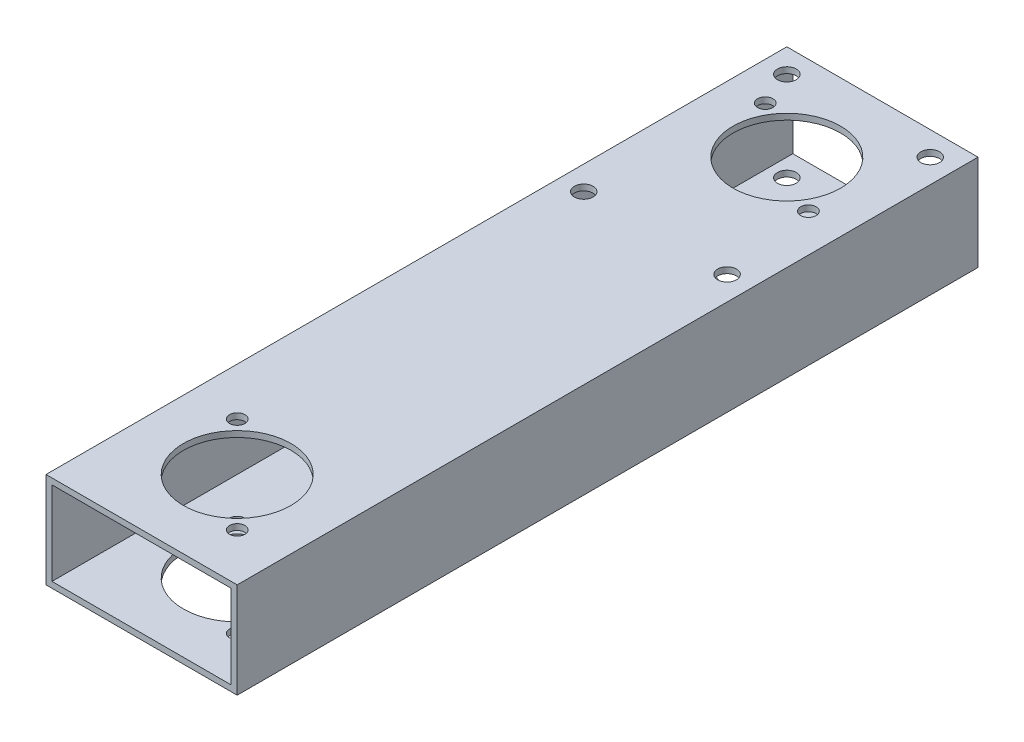
ISO-10303-21;
HEADER;
FILE_DESCRIPTION(('STEP AP214'),'2;1');
FILE_NAME('part.step','',(''),(''),'','','');
FILE_SCHEMA(('AUTOMOTIVE_DESIGN { 1 0 10303 214 1 1 1 1 }'));
ENDSEC;
DATA;
#1=APPLICATION_CONTEXT('core data for automotive mechanical design processes');
#2=APPLICATION_PROTOCOL_DEFINITION('international standard','automotive_design',2000,#1);
#3=PRODUCT_CONTEXT('',#1,'mechanical');
#4=PRODUCT('Part','Part','',(#3));
#5=PRODUCT_RELATED_PRODUCT_CATEGORY('part','',(#4));
#6=PRODUCT_DEFINITION_FORMATION('','',#4);
#7=PRODUCT_DEFINITION_CONTEXT('part definition',#1,'design');
#8=PRODUCT_DEFINITION('design','',#6,#7);
#9=PRODUCT_DEFINITION_SHAPE('','',#8);
#10=(LENGTH_UNIT() NAMED_UNIT(*) SI_UNIT(.MILLI.,.METRE.));
#11=(NAMED_UNIT(*) PLANE_ANGLE_UNIT() SI_UNIT($,.RADIAN.));
#12=(NAMED_UNIT(*) SI_UNIT($,.STERADIAN.) SOLID_ANGLE_UNIT());
#13=UNCERTAINTY_MEASURE_WITH_UNIT(LENGTH_MEASURE(1.E-05),#10,'distance_accuracy_value','');
#14=(GEOMETRIC_REPRESENTATION_CONTEXT(3) GLOBAL_UNCERTAINTY_ASSIGNED_CONTEXT((#13)) GLOBAL_UNIT_ASSIGNED_CONTEXT((#10,
#11,#12)) REPRESENTATION_CONTEXT('',''));
#15=CARTESIAN_POINT('',(0.,0.,0.));
#16=DIRECTION('',(0.,0.,1.));
#17=DIRECTION('',(1.,0.,0.));
#18=AXIS2_PLACEMENT_3D('',#15,#16,#17);
#19=CARTESIAN_POINT('',(25.4,12.7,98.4249994920001));
#20=DIRECTION('',(0.,-1.,0.));
#21=DIRECTION('',(1.,0.,0.));
#22=AXIS2_PLACEMENT_3D('',#19,#20,#21);
#23=PLANE('',#22);
#24=CARTESIAN_POINT('',(15.2936993631817,12.7,-63.4684359846216));
#25=DIRECTION('',(0.,1.,0.));
#26=DIRECTION('',(0.,0.,1.));
#27=AXIS2_PLACEMENT_3D('',#24,#25,#26);
#28=CIRCLE('',#27,2.04469999999999);
#29=CARTESIAN_POINT('',(15.2936993631817,12.7,-61.4237359846216));
#30=VERTEX_POINT('',#29);
#31=EDGE_CURVE('E485',#30,#30,#28,.T.);
#32=ORIENTED_EDGE('',*,*,#31,.F.);
#33=EDGE_LOOP('',(#32));
#34=FACE_BOUND('',#33,.T.);
#35=CARTESIAN_POINT('',(-12.751963692348,12.7,60.2730363083195));
#36=DIRECTION('',(0.,1.,0.));
#37=DIRECTION('',(0.,0.,1.));
#38=AXIS2_PLACEMENT_3D('',#35,#36,#37);
#39=CIRCLE('',#38,2.04469999999999);
#40=CARTESIAN_POINT('',(-12.751963692348,12.7,62.3177363083195));
#41=VERTEX_POINT('',#40);
#42=EDGE_CURVE('E254',#41,#41,#39,.T.);
#43=ORIENTED_EDGE('',*,*,#42,.F.);
#44=EDGE_LOOP('',(#43));
#45=FACE_BOUND('',#44,.T.);
#46=CARTESIAN_POINT('',(12.7519636914884,12.7,85.7769636921559));
#47=DIRECTION('',(0.,1.,0.));
#48=DIRECTION('',(0.,0.,1.));
#49=AXIS2_PLACEMENT_3D('',#46,#47,#48);
#50=CIRCLE('',#49,2.04469999999999);
#51=CARTESIAN_POINT('',(12.7519636914884,12.7,87.8216636921559));
#52=VERTEX_POINT('',#51);
#53=EDGE_CURVE('E251',#52,#52,#50,.T.);
#54=ORIENTED_EDGE('',*,*,#53,.F.);
#55=EDGE_LOOP('',(#54));
#56=FACE_BOUND('',#55,.T.);
#57=CARTESIAN_POINT('',(19.0500000000006,12.7,-38.0999994917968));
#58=DIRECTION('',(0.,1.,0.));
#59=DIRECTION('',(0.,0.,1.));
#60=AXIS2_PLACEMENT_3D('',#57,#58,#59);
#61=CIRCLE('',#60,2.48919999999999);
#62=CARTESIAN_POINT('',(19.0500000000006,12.7,-35.6107994917968));
#63=VERTEX_POINT('',#62);
#64=EDGE_CURVE('E274',#63,#63,#61,.T.);
#65=ORIENTED_EDGE('',*,*,#64,.F.);
#66=EDGE_LOOP('',(#65));
#67=FACE_BOUND('',#66,.T.);
#68=CARTESIAN_POINT('',(19.0500000000007,12.7,-92.0749994917965));
#69=DIRECTION('',(0.,1.,0.));
#70=DIRECTION('',(0.,0.,1.));
#71=AXIS2_PLACEMENT_3D('',#68,#69,#70);
#72=CIRCLE('',#71,2.48919999999999);
#73=CARTESIAN_POINT('',(19.0500000000007,12.7,-89.5857994917965));
#74=VERTEX_POINT('',#73);
#75=EDGE_CURVE('E284',#74,#74,#72,.T.);
#76=ORIENTED_EDGE('',*,*,#75,.F.);
#77=EDGE_LOOP('',(#76));
#78=FACE_BOUND('',#77,.T.);
#79=CARTESIAN_POINT('',(-19.0500000000001,12.7,-92.0749994917969));
#80=DIRECTION('',(0.,1.,0.));
#81=DIRECTION('',(0.,0.,1.));
#82=AXIS2_PLACEMENT_3D('',#79,#80,#81);
#83=CIRCLE('',#82,2.48919999999999);
#84=CARTESIAN_POINT('',(-19.0500000000001,12.7,-89.5857994917969));
#85=VERTEX_POINT('',#84);
#86=EDGE_CURVE('E294',#85,#85,#83,.T.);
#87=ORIENTED_EDGE('',*,*,#86,.F.);
#88=EDGE_LOOP('',(#87));
#89=FACE_BOUND('',#88,.T.);
#90=CARTESIAN_POINT('',(-19.0500000000001,12.7,-38.0999994917969));
#91=DIRECTION('',(0.,1.,0.));
#92=DIRECTION('',(0.,0.,1.));
#93=AXIS2_PLACEMENT_3D('',#90,#91,#92);
#94=CIRCLE('',#93,2.48919999999999);
#95=CARTESIAN_POINT('',(-19.0500000000001,12.7,-35.6107994917969));
#96=VERTEX_POINT('',#95);
#97=EDGE_CURVE('E304',#96,#96,#94,.T.);
#98=ORIENTED_EDGE('',*,*,#97,.F.);
#99=EDGE_LOOP('',(#98));
#100=FACE_BOUND('',#99,.T.);
#101=CARTESIAN_POINT('',(0.,12.7,-73.025));
#102=DIRECTION('',(0.,-1.,0.));
#103=DIRECTION('',(1.,0.,0.));
#104=AXIS2_PLACEMENT_3D('',#101,#102,#103);
#105=CIRCLE('',#104,14.2875);
#106=CARTESIAN_POINT('',(14.2875,12.7,-73.025));
#107=VERTEX_POINT('',#106);
#108=EDGE_CURVE('E207',#107,#107,#105,.T.);
#109=ORIENTED_EDGE('',*,*,#108,.T.);
#110=EDGE_LOOP('',(#109));
#111=FACE_BOUND('',#110,.T.);
#112=CARTESIAN_POINT('',(0.,12.7,73.025));
#113=DIRECTION('',(0.,-1.,0.));
#114=DIRECTION('',(1.,0.,0.));
#115=AXIS2_PLACEMENT_3D('',#112,#113,#114);
#116=CIRCLE('',#115,14.2875);
#117=CARTESIAN_POINT('',(14.2875,12.7,73.025));
#118=VERTEX_POINT('',#117);
#119=EDGE_CURVE('E314',#118,#118,#116,.T.);
#120=ORIENTED_EDGE('',*,*,#119,.T.);
#121=EDGE_LOOP('',(#120));
#122=FACE_BOUND('',#121,.T.);
#123=DIRECTION('',(0.,0.,-1.));
#124=VECTOR('',#123,1.);
#125=CARTESIAN_POINT('',(25.4,12.7,98.4249994920001));
#126=LINE('',#125,#124);
#127=CARTESIAN_POINT('',(25.4,12.7,98.4249994920001));
#128=VERTEX_POINT('',#127);
#129=CARTESIAN_POINT('',(25.4,12.7,-98.4249994920001));
#130=VERTEX_POINT('',#129);
#131=EDGE_CURVE('E197',#128,#130,#126,.T.);
#132=ORIENTED_EDGE('',*,*,#131,.T.);
#133=DIRECTION('',(-1.,0.,0.));
#134=VECTOR('',#133,1.);
#135=CARTESIAN_POINT('',(25.4,12.7,-98.4249994920001));
#136=LINE('',#135,#134);
#137=CARTESIAN_POINT('',(-25.4,12.7,-98.4249994920001));
#138=VERTEX_POINT('',#137);
#139=EDGE_CURVE('E162',#130,#138,#136,.T.);
#140=ORIENTED_EDGE('',*,*,#139,.T.);
#141=DIRECTION('',(0.,0.,-1.));
#142=VECTOR('',#141,1.);
#143=CARTESIAN_POINT('',(-25.4,12.7,98.4249994920001));
#144=LINE('',#143,#142);
#145=CARTESIAN_POINT('',(-25.4,12.7,98.4249994920001));
#146=VERTEX_POINT('',#145);
#147=EDGE_CURVE('E194',#146,#138,#144,.T.);
#148=ORIENTED_EDGE('',*,*,#147,.F.);
#149=DIRECTION('',(-1.,0.,0.));
#150=VECTOR('',#149,1.);
#151=CARTESIAN_POINT('',(25.4,12.7,98.4249994920001));
#152=LINE('',#151,#150);
#153=EDGE_CURVE('E66',#128,#146,#152,.T.);
#154=ORIENTED_EDGE('',*,*,#153,.F.);
#155=EDGE_LOOP('',(#132,#140,#148,#154));
#156=FACE_BOUND('',#155,.T.);
#157=CARTESIAN_POINT('',(-15.2936993640404,12.7,-82.5815640149031));
#158=DIRECTION('',(0.,1.,0.));
#159=DIRECTION('',(0.,0.,1.));
#160=AXIS2_PLACEMENT_3D('',#157,#158,#159);
#161=CIRCLE('',#160,2.04469999999999);
#162=CARTESIAN_POINT('',(-15.2936993640404,12.7,-80.5368640149031));
#163=VERTEX_POINT('',#162);
#164=EDGE_CURVE('E474',#163,#163,#161,.T.);
#165=ORIENTED_EDGE('',*,*,#164,.F.);
#166=EDGE_LOOP('',(#165));
#167=FACE_BOUND('',#166,.T.);
#168=ADVANCED_FACE('F40',(#34,#45,#56,#67,#78,#89,#100,#111,#122,#156,#167),#23,.F.);
#169=CARTESIAN_POINT('',(0.,0.,98.4249994920001));
#170=DIRECTION('',(0.,0.,1.));
#171=DIRECTION('',(1.,0.,0.));
#172=AXIS2_PLACEMENT_3D('',#169,#170,#171);
#173=PLANE('',#172);
#174=DIRECTION('',(0.,-1.,0.));
#175=VECTOR('',#174,1.);
#176=CARTESIAN_POINT('',(-25.4,12.7,98.4249994920001));
#177=LINE('',#176,#175);
#178=CARTESIAN_POINT('',(-25.4,-12.7,98.4249994920001));
#179=VERTEX_POINT('',#178);
#180=EDGE_CURVE('E120',#146,#179,#177,.T.);
#181=ORIENTED_EDGE('',*,*,#180,.T.);
#182=DIRECTION('',(1.,0.,0.));
#183=VECTOR('',#182,1.);
#184=CARTESIAN_POINT('',(-25.4,-12.7,98.4249994920001));
#185=LINE('',#184,#183);
#186=CARTESIAN_POINT('',(25.4,-12.7,98.4249994920001));
#187=VERTEX_POINT('',#186);
#188=EDGE_CURVE('E186',#179,#187,#185,.T.);
#189=ORIENTED_EDGE('',*,*,#188,.T.);
#190=DIRECTION('',(0.,1.,0.));
#191=VECTOR('',#190,1.);
#192=CARTESIAN_POINT('',(25.4,-12.7,98.4249994920001));
#193=LINE('',#192,#191);
#194=EDGE_CURVE('E189',#187,#128,#193,.T.);
#195=ORIENTED_EDGE('',*,*,#194,.T.);
#196=ORIENTED_EDGE('',*,*,#153,.T.);
#197=EDGE_LOOP('',(#181,#189,#195,#196));
#198=FACE_BOUND('',#197,.T.);
#199=DIRECTION('',(1.,0.,0.));
#200=VECTOR('',#199,1.);
#201=CARTESIAN_POINT('',(-23.8125,-11.1125,98.4249994920001));
#202=LINE('',#201,#200);
#203=CARTESIAN_POINT('',(-23.8125,-11.1125,98.4249994920001));
#204=VERTEX_POINT('',#203);
#205=CARTESIAN_POINT('',(23.8125,-11.1125,98.4249994920001));
#206=VERTEX_POINT('',#205);
#207=EDGE_CURVE('E168',#204,#206,#202,.T.);
#208=ORIENTED_EDGE('',*,*,#207,.F.);
#209=DIRECTION('',(0.,-1.,0.));
#210=VECTOR('',#209,1.);
#211=CARTESIAN_POINT('',(-23.8125,11.1125,98.4249994920001));
#212=LINE('',#211,#210);
#213=CARTESIAN_POINT('',(-23.8125,11.1125,98.4249994920001));
#214=VERTEX_POINT('',#213);
#215=EDGE_CURVE('E116',#214,#204,#212,.T.);
#216=ORIENTED_EDGE('',*,*,#215,.F.);
#217=DIRECTION('',(-1.,0.,0.));
#218=VECTOR('',#217,1.);
#219=CARTESIAN_POINT('',(23.8125,11.1125,98.4249994920001));
#220=LINE('',#219,#218);
#221=CARTESIAN_POINT('',(23.8125,11.1125,98.4249994920001));
#222=VERTEX_POINT('',#221);
#223=EDGE_CURVE('E174',#222,#214,#220,.T.);
#224=ORIENTED_EDGE('',*,*,#223,.F.);
#225=DIRECTION('',(0.,1.,0.));
#226=VECTOR('',#225,1.);
#227=CARTESIAN_POINT('',(23.8125,-11.1125,98.4249994920001));
#228=LINE('',#227,#226);
#229=EDGE_CURVE('E171',#206,#222,#228,.T.);
#230=ORIENTED_EDGE('',*,*,#229,.F.);
#231=EDGE_LOOP('',(#208,#216,#224,#230));
#232=FACE_BOUND('',#231,.T.);
#233=ADVANCED_FACE('F352',(#198,#232),#173,.T.);
#234=CARTESIAN_POINT('',(-25.4,12.7,98.4249994920001));
#235=DIRECTION('',(1.,0.,0.));
#236=DIRECTION('',(0.,0.,-1.));
#237=AXIS2_PLACEMENT_3D('',#234,#235,#236);
#238=PLANE('',#237);
#239=ORIENTED_EDGE('',*,*,#147,.T.);
#240=DIRECTION('',(0.,-1.,0.));
#241=VECTOR('',#240,1.);
#242=CARTESIAN_POINT('',(-25.4,12.7,-98.4249994920001));
#243=LINE('',#242,#241);
#244=CARTESIAN_POINT('',(-25.4,-12.7,-98.4249994920001));
#245=VERTEX_POINT('',#244);
#246=EDGE_CURVE('E150',#138,#245,#243,.T.);
#247=ORIENTED_EDGE('',*,*,#246,.T.);
#248=DIRECTION('',(0.,0.,-1.));
#249=VECTOR('',#248,1.);
#250=CARTESIAN_POINT('',(-25.4,-12.7,98.4249994920001));
#251=LINE('',#250,#249);
#252=EDGE_CURVE('E11',#179,#245,#251,.T.);
#253=ORIENTED_EDGE('',*,*,#252,.F.);
#254=ORIENTED_EDGE('',*,*,#180,.F.);
#255=EDGE_LOOP('',(#239,#247,#253,#254));
#256=FACE_BOUND('',#255,.T.);
#257=ADVANCED_FACE('F42',(#256),#238,.F.);
#258=CARTESIAN_POINT('',(-25.4,-12.7,98.4249994920001));
#259=DIRECTION('',(0.,1.,0.));
#260=DIRECTION('',(-1.,0.,0.));
#261=AXIS2_PLACEMENT_3D('',#258,#259,#260);
#262=PLANE('',#261);
#263=CARTESIAN_POINT('',(-15.2936993640404,-12.7,-82.5815640149031));
#264=DIRECTION('',(0.,1.,0.));
#265=DIRECTION('',(0.,0.,1.));
#266=AXIS2_PLACEMENT_3D('',#263,#264,#265);
#267=CIRCLE('',#266,2.0447);
#268=CARTESIAN_POINT('',(-15.2936993640404,-12.7,-80.5368640149031));
#269=VERTEX_POINT('',#268);
#270=EDGE_CURVE('E374',#269,#269,#267,.T.);
#271=ORIENTED_EDGE('',*,*,#270,.T.);
#272=EDGE_LOOP('',(#271));
#273=FACE_BOUND('',#272,.T.);
#274=CARTESIAN_POINT('',(15.2936993631817,-12.7,-63.4684359846216));
#275=DIRECTION('',(0.,1.,0.));
#276=DIRECTION('',(0.,0.,1.));
#277=AXIS2_PLACEMENT_3D('',#274,#275,#276);
#278=CIRCLE('',#277,2.0447);
#279=CARTESIAN_POINT('',(15.2936993631817,-12.7,-61.4237359846216));
#280=VERTEX_POINT('',#279);
#281=EDGE_CURVE('E377',#280,#280,#278,.T.);
#282=ORIENTED_EDGE('',*,*,#281,.T.);
#283=EDGE_LOOP('',(#282));
#284=FACE_BOUND('',#283,.T.);
#285=CARTESIAN_POINT('',(-12.751963692348,-12.7,60.2730363083195));
#286=DIRECTION('',(0.,1.,0.));
#287=DIRECTION('',(0.,0.,1.));
#288=AXIS2_PLACEMENT_3D('',#285,#286,#287);
#289=CIRCLE('',#288,2.0447);
#290=CARTESIAN_POINT('',(-12.751963692348,-12.7,62.3177363083195));
#291=VERTEX_POINT('',#290);
#292=EDGE_CURVE('E244',#291,#291,#289,.T.);
#293=ORIENTED_EDGE('',*,*,#292,.T.);
#294=EDGE_LOOP('',(#293));
#295=FACE_BOUND('',#294,.T.);
#296=CARTESIAN_POINT('',(12.7519636914884,-12.7,85.7769636921559));
#297=DIRECTION('',(0.,1.,0.));
#298=DIRECTION('',(0.,0.,1.));
#299=AXIS2_PLACEMENT_3D('',#296,#297,#298);
#300=CIRCLE('',#299,2.0447);
#301=CARTESIAN_POINT('',(12.7519636914884,-12.7,87.8216636921559));
#302=VERTEX_POINT('',#301);
#303=EDGE_CURVE('E239',#302,#302,#300,.T.);
#304=ORIENTED_EDGE('',*,*,#303,.T.);
#305=EDGE_LOOP('',(#304));
#306=FACE_BOUND('',#305,.T.);
#307=CARTESIAN_POINT('',(19.0500000000006,-12.7,-38.0999994917968));
#308=DIRECTION('',(0.,1.,0.));
#309=DIRECTION('',(0.,0.,1.));
#310=AXIS2_PLACEMENT_3D('',#307,#308,#309);
#311=CIRCLE('',#310,2.48919999999999);
#312=CARTESIAN_POINT('',(19.0500000000006,-12.7,-35.6107994917968));
#313=VERTEX_POINT('',#312);
#314=EDGE_CURVE('E234',#313,#313,#311,.T.);
#315=ORIENTED_EDGE('',*,*,#314,.T.);
#316=EDGE_LOOP('',(#315));
#317=FACE_BOUND('',#316,.T.);
#318=CARTESIAN_POINT('',(19.0500000000007,-12.7,-92.0749994917965));
#319=DIRECTION('',(0.,1.,0.));
#320=DIRECTION('',(0.,0.,1.));
#321=AXIS2_PLACEMENT_3D('',#318,#319,#320);
#322=CIRCLE('',#321,2.48919999999999);
#323=CARTESIAN_POINT('',(19.0500000000007,-12.7,-89.5857994917965));
#324=VERTEX_POINT('',#323);
#325=EDGE_CURVE('E228',#324,#324,#322,.T.);
#326=ORIENTED_EDGE('',*,*,#325,.T.);
#327=EDGE_LOOP('',(#326));
#328=FACE_BOUND('',#327,.T.);
#329=CARTESIAN_POINT('',(-19.0500000000001,-12.7,-92.0749994917969));
#330=DIRECTION('',(0.,1.,0.));
#331=DIRECTION('',(0.,0.,1.));
#332=AXIS2_PLACEMENT_3D('',#329,#330,#331);
#333=CIRCLE('',#332,2.48919999999999);
#334=CARTESIAN_POINT('',(-19.0500000000001,-12.7,-89.5857994917969));
#335=VERTEX_POINT('',#334);
#336=EDGE_CURVE('E222',#335,#335,#333,.T.);
#337=ORIENTED_EDGE('',*,*,#336,.T.);
#338=EDGE_LOOP('',(#337));
#339=FACE_BOUND('',#338,.T.);
#340=CARTESIAN_POINT('',(-19.0500000000001,-12.7,-38.0999994917969));
#341=DIRECTION('',(0.,1.,0.));
#342=DIRECTION('',(0.,0.,1.));
#343=AXIS2_PLACEMENT_3D('',#340,#341,#342);
#344=CIRCLE('',#343,2.48919999999999);
#345=CARTESIAN_POINT('',(-19.0500000000001,-12.7,-35.6107994917969));
#346=VERTEX_POINT('',#345);
#347=EDGE_CURVE('E216',#346,#346,#344,.T.);
#348=ORIENTED_EDGE('',*,*,#347,.T.);
#349=EDGE_LOOP('',(#348));
#350=FACE_BOUND('',#349,.T.);
#351=CARTESIAN_POINT('',(0.,-12.7,-73.025));
#352=DIRECTION('',(0.,-1.,0.));
#353=DIRECTION('',(1.,0.,0.));
#354=AXIS2_PLACEMENT_3D('',#351,#352,#353);
#355=CIRCLE('',#354,14.2875);
#356=CARTESIAN_POINT('',(14.2875,-12.7,-73.025));
#357=VERTEX_POINT('',#356);
#358=EDGE_CURVE('E318',#357,#357,#355,.T.);
#359=ORIENTED_EDGE('',*,*,#358,.F.);
#360=EDGE_LOOP('',(#359));
#361=FACE_BOUND('',#360,.T.);
#362=CARTESIAN_POINT('',(0.,-12.7,73.025));
#363=DIRECTION('',(0.,-1.,0.));
#364=DIRECTION('',(1.,0.,0.));
#365=AXIS2_PLACEMENT_3D('',#362,#363,#364);
#366=CIRCLE('',#365,14.2875);
#367=CARTESIAN_POINT('',(14.2875,-12.7,73.025));
#368=VERTEX_POINT('',#367);
#369=EDGE_CURVE('E322',#368,#368,#366,.T.);
#370=ORIENTED_EDGE('',*,*,#369,.F.);
#371=EDGE_LOOP('',(#370));
#372=FACE_BOUND('',#371,.T.);
#373=ORIENTED_EDGE('',*,*,#252,.T.);
#374=DIRECTION('',(1.,0.,0.));
#375=VECTOR('',#374,1.);
#376=CARTESIAN_POINT('',(-25.4,-12.7,-98.4249994920001));
#377=LINE('',#376,#375);
#378=CARTESIAN_POINT('',(25.4,-12.7,-98.4249994920001));
#379=VERTEX_POINT('',#378);
#380=EDGE_CURVE('E154',#245,#379,#377,.T.);
#381=ORIENTED_EDGE('',*,*,#380,.T.);
#382=DIRECTION('',(0.,0.,-1.));
#383=VECTOR('',#382,1.);
#384=CARTESIAN_POINT('',(25.4,-12.7,98.4249994920001));
#385=LINE('',#384,#383);
#386=EDGE_CURVE('E50',#187,#379,#385,.T.);
#387=ORIENTED_EDGE('',*,*,#386,.F.);
#388=ORIENTED_EDGE('',*,*,#188,.F.);
#389=EDGE_LOOP('',(#373,#381,#387,#388));
#390=FACE_BOUND('',#389,.T.);
#391=ADVANCED_FACE('F363',(#273,#284,#295,#306,#317,#328,#339,#350,#361,#372,#390),#262,.F.);
#392=CARTESIAN_POINT('',(25.4,-12.7,98.4249994920001));
#393=DIRECTION('',(-1.,0.,0.));
#394=DIRECTION('',(0.,0.,1.));
#395=AXIS2_PLACEMENT_3D('',#392,#393,#394);
#396=PLANE('',#395);
#397=ORIENTED_EDGE('',*,*,#386,.T.);
#398=DIRECTION('',(0.,1.,0.));
#399=VECTOR('',#398,1.);
#400=CARTESIAN_POINT('',(25.4,-12.7,-98.4249994920001));
#401=LINE('',#400,#399);
#402=EDGE_CURVE('E158',#379,#130,#401,.T.);
#403=ORIENTED_EDGE('',*,*,#402,.T.);
#404=ORIENTED_EDGE('',*,*,#131,.F.);
#405=ORIENTED_EDGE('',*,*,#194,.F.);
#406=EDGE_LOOP('',(#397,#403,#404,#405));
#407=FACE_BOUND('',#406,.T.);
#408=ADVANCED_FACE('F347',(#407),#396,.F.);
#409=CARTESIAN_POINT('',(-23.8125,11.1125,98.4249994920001));
#410=DIRECTION('',(1.,0.,0.));
#411=DIRECTION('',(0.,1.,0.));
#412=AXIS2_PLACEMENT_3D('',#409,#410,#411);
#413=PLANE('',#412);
#414=DIRECTION('',(0.,0.,-1.));
#415=VECTOR('',#414,1.);
#416=CARTESIAN_POINT('',(-23.8125,-11.1125,98.4249994920001));
#417=LINE('',#416,#415);
#418=CARTESIAN_POINT('',(-23.8125,-11.1125,-98.4249994920001));
#419=VERTEX_POINT('',#418);
#420=EDGE_CURVE('E108',#204,#419,#417,.T.);
#421=ORIENTED_EDGE('',*,*,#420,.T.);
#422=DIRECTION('',(0.,-1.,0.));
#423=VECTOR('',#422,1.);
#424=CARTESIAN_POINT('',(-23.8125,11.1125,-98.4249994920001));
#425=LINE('',#424,#423);
#426=CARTESIAN_POINT('',(-23.8125,11.1125,-98.4249994920001));
#427=VERTEX_POINT('',#426);
#428=EDGE_CURVE('E113',#427,#419,#425,.T.);
#429=ORIENTED_EDGE('',*,*,#428,.F.);
#430=DIRECTION('',(0.,0.,-1.));
#431=VECTOR('',#430,1.);
#432=CARTESIAN_POINT('',(-23.8125,11.1125,98.4249994920001));
#433=LINE('',#432,#431);
#434=EDGE_CURVE('E177',#214,#427,#433,.T.);
#435=ORIENTED_EDGE('',*,*,#434,.F.);
#436=ORIENTED_EDGE('',*,*,#215,.T.);
#437=EDGE_LOOP('',(#421,#429,#435,#436));
#438=FACE_BOUND('',#437,.T.);
#439=ADVANCED_FACE('F110',(#438),#413,.T.);
#440=CARTESIAN_POINT('',(-23.8125,-11.1125,98.4249994920001));
#441=DIRECTION('',(0.,1.,0.));
#442=DIRECTION('',(0.,0.,1.));
#443=AXIS2_PLACEMENT_3D('',#440,#441,#442);
#444=PLANE('',#443);
#445=CARTESIAN_POINT('',(-15.2936993640404,-11.1125,-82.5815640149031));
#446=DIRECTION('',(0.,1.,0.));
#447=DIRECTION('',(0.,0.,1.));
#448=AXIS2_PLACEMENT_3D('',#445,#446,#447);
#449=CIRCLE('',#448,2.04469999999999);
#450=CARTESIAN_POINT('',(-15.2936993640404,-11.1125,-80.5368640149031));
#451=VERTEX_POINT('',#450);
#452=EDGE_CURVE('E481',#451,#451,#449,.T.);
#453=ORIENTED_EDGE('',*,*,#452,.F.);
#454=EDGE_LOOP('',(#453));
#455=FACE_BOUND('',#454,.T.);
#456=CARTESIAN_POINT('',(15.2936993631817,-11.1125,-63.4684359846216));
#457=DIRECTION('',(0.,1.,0.));
#458=DIRECTION('',(0.,0.,1.));
#459=AXIS2_PLACEMENT_3D('',#456,#457,#458);
#460=CIRCLE('',#459,2.04469999999999);
#461=CARTESIAN_POINT('',(15.2936993631817,-11.1125,-61.4237359846216));
#462=VERTEX_POINT('',#461);
#463=EDGE_CURVE('E261',#462,#462,#460,.T.);
#464=ORIENTED_EDGE('',*,*,#463,.F.);
#465=EDGE_LOOP('',(#464));
#466=FACE_BOUND('',#465,.T.);
#467=CARTESIAN_POINT('',(-12.751963692348,-11.1125,60.2730363083195));
#468=DIRECTION('',(0.,1.,0.));
#469=DIRECTION('',(0.,0.,1.));
#470=AXIS2_PLACEMENT_3D('',#467,#468,#469);
#471=CIRCLE('',#470,2.04469999999999);
#472=CARTESIAN_POINT('',(-12.751963692348,-11.1125,62.3177363083195));
#473=VERTEX_POINT('',#472);
#474=EDGE_CURVE('E240',#473,#473,#471,.T.);
#475=ORIENTED_EDGE('',*,*,#474,.F.);
#476=EDGE_LOOP('',(#475));
#477=FACE_BOUND('',#476,.T.);
#478=CARTESIAN_POINT('',(12.7519636914884,-11.1125,85.7769636921559));
#479=DIRECTION('',(0.,1.,0.));
#480=DIRECTION('',(0.,0.,1.));
#481=AXIS2_PLACEMENT_3D('',#478,#479,#480);
#482=CIRCLE('',#481,2.04469999999999);
#483=CARTESIAN_POINT('',(12.7519636914884,-11.1125,87.8216636921559));
#484=VERTEX_POINT('',#483);
#485=EDGE_CURVE('E235',#484,#484,#482,.T.);
#486=ORIENTED_EDGE('',*,*,#485,.F.);
#487=EDGE_LOOP('',(#486));
#488=FACE_BOUND('',#487,.T.);
#489=CARTESIAN_POINT('',(19.0500000000006,-11.1125,-38.0999994917968));
#490=DIRECTION('',(0.,1.,0.));
#491=DIRECTION('',(0.,0.,1.));
#492=AXIS2_PLACEMENT_3D('',#489,#490,#491);
#493=CIRCLE('',#492,2.48919999999999);
#494=CARTESIAN_POINT('',(19.0500000000006,-11.1125,-35.6107994917968));
#495=VERTEX_POINT('',#494);
#496=EDGE_CURVE('E229',#495,#495,#493,.T.);
#497=ORIENTED_EDGE('',*,*,#496,.F.);
#498=EDGE_LOOP('',(#497));
#499=FACE_BOUND('',#498,.T.);
#500=CARTESIAN_POINT('',(19.0500000000007,-11.1125,-92.0749994917965));
#501=DIRECTION('',(0.,1.,0.));
#502=DIRECTION('',(0.,0.,1.));
#503=AXIS2_PLACEMENT_3D('',#500,#501,#502);
#504=CIRCLE('',#503,2.48919999999999);
#505=CARTESIAN_POINT('',(19.0500000000007,-11.1125,-89.5857994917965));
#506=VERTEX_POINT('',#505);
#507=EDGE_CURVE('E223',#506,#506,#504,.T.);
#508=ORIENTED_EDGE('',*,*,#507,.F.);
#509=EDGE_LOOP('',(#508));
#510=FACE_BOUND('',#509,.T.);
#511=CARTESIAN_POINT('',(-19.0500000000001,-11.1125,-92.0749994917969));
#512=DIRECTION('',(0.,1.,0.));
#513=DIRECTION('',(0.,0.,1.));
#514=AXIS2_PLACEMENT_3D('',#511,#512,#513);
#515=CIRCLE('',#514,2.48919999999999);
#516=CARTESIAN_POINT('',(-19.0500000000001,-11.1125,-89.5857994917969));
#517=VERTEX_POINT('',#516);
#518=EDGE_CURVE('E217',#517,#517,#515,.T.);
#519=ORIENTED_EDGE('',*,*,#518,.F.);
#520=EDGE_LOOP('',(#519));
#521=FACE_BOUND('',#520,.T.);
#522=CARTESIAN_POINT('',(-19.0500000000001,-11.1125,-38.0999994917969));
#523=DIRECTION('',(0.,1.,0.));
#524=DIRECTION('',(0.,0.,1.));
#525=AXIS2_PLACEMENT_3D('',#522,#523,#524);
#526=CIRCLE('',#525,2.48919999999999);
#527=CARTESIAN_POINT('',(-19.0500000000001,-11.1125,-35.6107994917969));
#528=VERTEX_POINT('',#527);
#529=EDGE_CURVE('E211',#528,#528,#526,.T.);
#530=ORIENTED_EDGE('',*,*,#529,.F.);
#531=EDGE_LOOP('',(#530));
#532=FACE_BOUND('',#531,.T.);
#533=CARTESIAN_POINT('',(0.,-11.1125,-73.025));
#534=DIRECTION('',(0.,1.,0.));
#535=DIRECTION('',(0.,0.,1.));
#536=AXIS2_PLACEMENT_3D('',#533,#534,#535);
#537=CIRCLE('',#536,14.2875);
#538=CARTESIAN_POINT('',(0.,-11.1125,-58.7375));
#539=VERTEX_POINT('',#538);
#540=EDGE_CURVE('E137',#539,#539,#537,.T.);
#541=ORIENTED_EDGE('',*,*,#540,.F.);
#542=EDGE_LOOP('',(#541));
#543=FACE_BOUND('',#542,.T.);
#544=CARTESIAN_POINT('',(0.,-11.1125,73.025));
#545=DIRECTION('',(0.,1.,0.));
#546=DIRECTION('',(0.,0.,1.));
#547=AXIS2_PLACEMENT_3D('',#544,#545,#546);
#548=CIRCLE('',#547,14.2875);
#549=CARTESIAN_POINT('',(0.,-11.1125,87.3125));
#550=VERTEX_POINT('',#549);
#551=EDGE_CURVE('E206',#550,#550,#548,.T.);
#552=ORIENTED_EDGE('',*,*,#551,.F.);
#553=EDGE_LOOP('',(#552));
#554=FACE_BOUND('',#553,.T.);
#555=DIRECTION('',(0.,0.,-1.));
#556=VECTOR('',#555,1.);
#557=CARTESIAN_POINT('',(23.8125,-11.1125,98.4249994920001));
#558=LINE('',#557,#556);
#559=CARTESIAN_POINT('',(23.8125,-11.1125,-98.4249994920001));
#560=VERTEX_POINT('',#559);
#561=EDGE_CURVE('E121',#206,#560,#558,.T.);
#562=ORIENTED_EDGE('',*,*,#561,.T.);
#563=DIRECTION('',(1.,0.,0.));
#564=VECTOR('',#563,1.);
#565=CARTESIAN_POINT('',(-23.8125,-11.1125,-98.4249994920001));
#566=LINE('',#565,#564);
#567=EDGE_CURVE('E124',#419,#560,#566,.T.);
#568=ORIENTED_EDGE('',*,*,#567,.F.);
#569=ORIENTED_EDGE('',*,*,#420,.F.);
#570=ORIENTED_EDGE('',*,*,#207,.T.);
#571=EDGE_LOOP('',(#562,#568,#569,#570));
#572=FACE_BOUND('',#571,.T.);
#573=ADVANCED_FACE('F125',(#455,#466,#477,#488,#499,#510,#521,#532,#543,#554,#572),#444,.T.);
#574=CARTESIAN_POINT('',(23.8125,-11.1125,98.4249994920001));
#575=DIRECTION('',(-1.,0.,0.));
#576=DIRECTION('',(0.,0.,1.));
#577=AXIS2_PLACEMENT_3D('',#574,#575,#576);
#578=PLANE('',#577);
#579=DIRECTION('',(0.,0.,-1.));
#580=VECTOR('',#579,1.);
#581=CARTESIAN_POINT('',(23.8125,11.1125,98.4249994920001));
#582=LINE('',#581,#580);
#583=CARTESIAN_POINT('',(23.8125,11.1125,-98.4249994920001));
#584=VERTEX_POINT('',#583);
#585=EDGE_CURVE('E58',#222,#584,#582,.T.);
#586=ORIENTED_EDGE('',*,*,#585,.T.);
#587=DIRECTION('',(0.,1.,0.));
#588=VECTOR('',#587,1.);
#589=CARTESIAN_POINT('',(23.8125,-11.1125,-98.4249994920001));
#590=LINE('',#589,#588);
#591=EDGE_CURVE('E131',#560,#584,#590,.T.);
#592=ORIENTED_EDGE('',*,*,#591,.F.);
#593=ORIENTED_EDGE('',*,*,#561,.F.);
#594=ORIENTED_EDGE('',*,*,#229,.T.);
#595=EDGE_LOOP('',(#586,#592,#593,#594));
#596=FACE_BOUND('',#595,.T.);
#597=ADVANCED_FACE('F337',(#596),#578,.T.);
#598=CARTESIAN_POINT('',(23.8125,11.1125,98.4249994920001));
#599=DIRECTION('',(0.,-1.,0.));
#600=DIRECTION('',(0.,0.,-1.));
#601=AXIS2_PLACEMENT_3D('',#598,#599,#600);
#602=PLANE('',#601);
#603=CARTESIAN_POINT('',(-15.2936993640404,11.1125,-82.5815640149031));
#604=DIRECTION('',(0.,-1.,0.));
#605=DIRECTION('',(0.,0.,-1.));
#606=AXIS2_PLACEMENT_3D('',#603,#604,#605);
#607=CIRCLE('',#606,2.04469999999999);
#608=CARTESIAN_POINT('',(-15.2936993640404,11.1125,-84.6262640149031));
#609=VERTEX_POINT('',#608);
#610=EDGE_CURVE('E44',#609,#609,#607,.T.);
#611=ORIENTED_EDGE('',*,*,#610,.F.);
#612=EDGE_LOOP('',(#611));
#613=FACE_BOUND('',#612,.T.);
#614=CARTESIAN_POINT('',(15.2936993631817,11.1125,-63.4684359846216));
#615=DIRECTION('',(0.,-1.,0.));
#616=DIRECTION('',(0.,0.,-1.));
#617=AXIS2_PLACEMENT_3D('',#614,#615,#616);
#618=CIRCLE('',#617,2.04469999999999);
#619=CARTESIAN_POINT('',(15.2936993631817,11.1125,-65.5131359846216));
#620=VERTEX_POINT('',#619);
#621=EDGE_CURVE('E491',#620,#620,#618,.T.);
#622=ORIENTED_EDGE('',*,*,#621,.F.);
#623=EDGE_LOOP('',(#622));
#624=FACE_BOUND('',#623,.T.);
#625=CARTESIAN_POINT('',(-12.751963692348,11.1125,60.2730363083195));
#626=DIRECTION('',(0.,-1.,0.));
#627=DIRECTION('',(0.,0.,-1.));
#628=AXIS2_PLACEMENT_3D('',#625,#626,#627);
#629=CIRCLE('',#628,2.04469999999999);
#630=CARTESIAN_POINT('',(-12.751963692348,11.1125,58.2283363083195));
#631=VERTEX_POINT('',#630);
#632=EDGE_CURVE('E243',#631,#631,#629,.T.);
#633=ORIENTED_EDGE('',*,*,#632,.F.);
#634=EDGE_LOOP('',(#633));
#635=FACE_BOUND('',#634,.T.);
#636=CARTESIAN_POINT('',(12.7519636914884,11.1125,85.7769636921559));
#637=DIRECTION('',(0.,-1.,0.));
#638=DIRECTION('',(0.,0.,-1.));
#639=AXIS2_PLACEMENT_3D('',#636,#637,#638);
#640=CIRCLE('',#639,2.04469999999999);
#641=CARTESIAN_POINT('',(12.7519636914884,11.1125,83.7322636921559));
#642=VERTEX_POINT('',#641);
#643=EDGE_CURVE('E238',#642,#642,#640,.T.);
#644=ORIENTED_EDGE('',*,*,#643,.F.);
#645=EDGE_LOOP('',(#644));
#646=FACE_BOUND('',#645,.T.);
#647=CARTESIAN_POINT('',(19.0500000000006,11.1125,-38.0999994917968));
#648=DIRECTION('',(0.,-1.,0.));
#649=DIRECTION('',(0.,0.,-1.));
#650=AXIS2_PLACEMENT_3D('',#647,#648,#649);
#651=CIRCLE('',#650,2.48919999999999);
#652=CARTESIAN_POINT('',(19.0500000000006,11.1125,-40.5891994917968));
#653=VERTEX_POINT('',#652);
#654=EDGE_CURVE('E233',#653,#653,#651,.T.);
#655=ORIENTED_EDGE('',*,*,#654,.F.);
#656=EDGE_LOOP('',(#655));
#657=FACE_BOUND('',#656,.T.);
#658=CARTESIAN_POINT('',(19.0500000000007,11.1125,-92.0749994917965));
#659=DIRECTION('',(0.,-1.,0.));
#660=DIRECTION('',(0.,0.,-1.));
#661=AXIS2_PLACEMENT_3D('',#658,#659,#660);
#662=CIRCLE('',#661,2.48919999999999);
#663=CARTESIAN_POINT('',(19.0500000000007,11.1125,-94.5641994917965));
#664=VERTEX_POINT('',#663);
#665=EDGE_CURVE('E227',#664,#664,#662,.T.);
#666=ORIENTED_EDGE('',*,*,#665,.F.);
#667=EDGE_LOOP('',(#666));
#668=FACE_BOUND('',#667,.T.);
#669=CARTESIAN_POINT('',(-19.0500000000001,11.1125,-92.0749994917969));
#670=DIRECTION('',(0.,-1.,0.));
#671=DIRECTION('',(0.,0.,-1.));
#672=AXIS2_PLACEMENT_3D('',#669,#670,#671);
#673=CIRCLE('',#672,2.48919999999999);
#674=CARTESIAN_POINT('',(-19.0500000000001,11.1125,-94.5641994917969));
#675=VERTEX_POINT('',#674);
#676=EDGE_CURVE('E221',#675,#675,#673,.T.);
#677=ORIENTED_EDGE('',*,*,#676,.F.);
#678=EDGE_LOOP('',(#677));
#679=FACE_BOUND('',#678,.T.);
#680=CARTESIAN_POINT('',(-19.0500000000001,11.1125,-38.0999994917969));
#681=DIRECTION('',(0.,-1.,0.));
#682=DIRECTION('',(0.,0.,-1.));
#683=AXIS2_PLACEMENT_3D('',#680,#681,#682);
#684=CIRCLE('',#683,2.48919999999999);
#685=CARTESIAN_POINT('',(-19.0500000000001,11.1125,-40.5891994917969));
#686=VERTEX_POINT('',#685);
#687=EDGE_CURVE('E215',#686,#686,#684,.T.);
#688=ORIENTED_EDGE('',*,*,#687,.F.);
#689=EDGE_LOOP('',(#688));
#690=FACE_BOUND('',#689,.T.);
#691=CARTESIAN_POINT('',(0.,11.1125,-73.025));
#692=DIRECTION('',(0.,-1.,0.));
#693=DIRECTION('',(0.,0.,-1.));
#694=AXIS2_PLACEMENT_3D('',#691,#692,#693);
#695=CIRCLE('',#694,14.2875);
#696=CARTESIAN_POINT('',(0.,11.1125,-87.3125));
#697=VERTEX_POINT('',#696);
#698=EDGE_CURVE('E142',#697,#697,#695,.T.);
#699=ORIENTED_EDGE('',*,*,#698,.F.);
#700=EDGE_LOOP('',(#699));
#701=FACE_BOUND('',#700,.T.);
#702=CARTESIAN_POINT('',(0.,11.1125,73.025));
#703=DIRECTION('',(0.,-1.,0.));
#704=DIRECTION('',(0.,0.,-1.));
#705=AXIS2_PLACEMENT_3D('',#702,#703,#704);
#706=CIRCLE('',#705,14.2875);
#707=CARTESIAN_POINT('',(0.,11.1125,58.7375));
#708=VERTEX_POINT('',#707);
#709=EDGE_CURVE('E202',#708,#708,#706,.T.);
#710=ORIENTED_EDGE('',*,*,#709,.F.);
#711=EDGE_LOOP('',(#710));
#712=FACE_BOUND('',#711,.T.);
#713=ORIENTED_EDGE('',*,*,#434,.T.);
#714=DIRECTION('',(-1.,0.,0.));
#715=VECTOR('',#714,1.);
#716=CARTESIAN_POINT('',(23.8125,11.1125,-98.4249994920001));
#717=LINE('',#716,#715);
#718=EDGE_CURVE('E135',#584,#427,#717,.T.);
#719=ORIENTED_EDGE('',*,*,#718,.F.);
#720=ORIENTED_EDGE('',*,*,#585,.F.);
#721=ORIENTED_EDGE('',*,*,#223,.T.);
#722=EDGE_LOOP('',(#713,#719,#720,#721));
#723=FACE_BOUND('',#722,.T.);
#724=ADVANCED_FACE('F344',(#613,#624,#635,#646,#657,#668,#679,#690,#701,#712,#723),#602,.T.);
#725=CARTESIAN_POINT('',(0.,0.,-98.4249994920001));
#726=DIRECTION('',(0.,0.,1.));
#727=DIRECTION('',(1.,0.,0.));
#728=AXIS2_PLACEMENT_3D('',#725,#726,#727);
#729=PLANE('',#728);
#730=ORIENTED_EDGE('',*,*,#718,.T.);
#731=ORIENTED_EDGE('',*,*,#428,.T.);
#732=ORIENTED_EDGE('',*,*,#567,.T.);
#733=ORIENTED_EDGE('',*,*,#591,.T.);
#734=EDGE_LOOP('',(#730,#731,#732,#733));
#735=FACE_BOUND('',#734,.T.);
#736=ORIENTED_EDGE('',*,*,#246,.F.);
#737=ORIENTED_EDGE('',*,*,#139,.F.);
#738=ORIENTED_EDGE('',*,*,#402,.F.);
#739=ORIENTED_EDGE('',*,*,#380,.F.);
#740=EDGE_LOOP('',(#736,#737,#738,#739));
#741=FACE_BOUND('',#740,.T.);
#742=ADVANCED_FACE('F133',(#735,#741),#729,.F.);
#743=CARTESIAN_POINT('',(0.,12.7,73.025));
#744=DIRECTION('',(0.,-1.,0.));
#745=DIRECTION('',(1.,0.,0.));
#746=AXIS2_PLACEMENT_3D('',#743,#744,#745);
#747=CYLINDRICAL_SURFACE('',#746,14.2875);
#748=ORIENTED_EDGE('',*,*,#709,.T.);
#749=EDGE_LOOP('',(#748));
#750=FACE_BOUND('',#749,.T.);
#751=ORIENTED_EDGE('',*,*,#119,.F.);
#752=EDGE_LOOP('',(#751));
#753=FACE_BOUND('',#752,.T.);
#754=ADVANCED_FACE('F413',(#750,#753),#747,.F.);
#755=CARTESIAN_POINT('',(0.,12.7,-73.025));
#756=DIRECTION('',(0.,-1.,0.));
#757=DIRECTION('',(1.,0.,0.));
#758=AXIS2_PLACEMENT_3D('',#755,#756,#757);
#759=CYLINDRICAL_SURFACE('',#758,14.2875);
#760=ORIENTED_EDGE('',*,*,#698,.T.);
#761=EDGE_LOOP('',(#760));
#762=FACE_BOUND('',#761,.T.);
#763=ORIENTED_EDGE('',*,*,#108,.F.);
#764=EDGE_LOOP('',(#763));
#765=FACE_BOUND('',#764,.T.);
#766=ADVANCED_FACE('F420',(#762,#765),#759,.F.);
#767=ORIENTED_EDGE('',*,*,#551,.T.);
#768=EDGE_LOOP('',(#767));
#769=FACE_BOUND('',#768,.T.);
#770=ORIENTED_EDGE('',*,*,#369,.T.);
#771=EDGE_LOOP('',(#770));
#772=FACE_BOUND('',#771,.T.);
#773=ADVANCED_FACE('F333',(#769,#772),#747,.F.);
#774=ORIENTED_EDGE('',*,*,#540,.T.);
#775=EDGE_LOOP('',(#774));
#776=FACE_BOUND('',#775,.T.);
#777=ORIENTED_EDGE('',*,*,#358,.T.);
#778=EDGE_LOOP('',(#777));
#779=FACE_BOUND('',#778,.T.);
#780=ADVANCED_FACE('F425',(#776,#779),#759,.F.);
#781=CARTESIAN_POINT('',(-19.0500000000001,12.7,-38.0999994917969));
#782=DIRECTION('',(0.,1.,0.));
#783=DIRECTION('',(0.,0.,1.));
#784=AXIS2_PLACEMENT_3D('',#781,#782,#783);
#785=CYLINDRICAL_SURFACE('',#784,2.48919999999999);
#786=ORIENTED_EDGE('',*,*,#529,.T.);
#787=EDGE_LOOP('',(#786));
#788=FACE_BOUND('',#787,.T.);
#789=ORIENTED_EDGE('',*,*,#347,.F.);
#790=EDGE_LOOP('',(#789));
#791=FACE_BOUND('',#790,.T.);
#792=ADVANCED_FACE('F426',(#788,#791),#785,.F.);
#793=ORIENTED_EDGE('',*,*,#687,.T.);
#794=EDGE_LOOP('',(#793));
#795=FACE_BOUND('',#794,.T.);
#796=ORIENTED_EDGE('',*,*,#97,.T.);
#797=EDGE_LOOP('',(#796));
#798=FACE_BOUND('',#797,.T.);
#799=ADVANCED_FACE('F429',(#795,#798),#785,.F.);
#800=CARTESIAN_POINT('',(-19.0500000000001,12.7,-92.0749994917969));
#801=DIRECTION('',(0.,1.,0.));
#802=DIRECTION('',(0.,0.,1.));
#803=AXIS2_PLACEMENT_3D('',#800,#801,#802);
#804=CYLINDRICAL_SURFACE('',#803,2.48919999999999);
#805=ORIENTED_EDGE('',*,*,#518,.T.);
#806=EDGE_LOOP('',(#805));
#807=FACE_BOUND('',#806,.T.);
#808=ORIENTED_EDGE('',*,*,#336,.F.);
#809=EDGE_LOOP('',(#808));
#810=FACE_BOUND('',#809,.T.);
#811=ADVANCED_FACE('F431',(#807,#810),#804,.F.);
#812=ORIENTED_EDGE('',*,*,#676,.T.);
#813=EDGE_LOOP('',(#812));
#814=FACE_BOUND('',#813,.T.);
#815=ORIENTED_EDGE('',*,*,#86,.T.);
#816=EDGE_LOOP('',(#815));
#817=FACE_BOUND('',#816,.T.);
#818=ADVANCED_FACE('F434',(#814,#817),#804,.F.);
#819=CARTESIAN_POINT('',(19.0500000000007,12.7,-92.0749994917965));
#820=DIRECTION('',(0.,1.,0.));
#821=DIRECTION('',(0.,0.,1.));
#822=AXIS2_PLACEMENT_3D('',#819,#820,#821);
#823=CYLINDRICAL_SURFACE('',#822,2.48919999999999);
#824=ORIENTED_EDGE('',*,*,#507,.T.);
#825=EDGE_LOOP('',(#824));
#826=FACE_BOUND('',#825,.T.);
#827=ORIENTED_EDGE('',*,*,#325,.F.);
#828=EDGE_LOOP('',(#827));
#829=FACE_BOUND('',#828,.T.);
#830=ADVANCED_FACE('F436',(#826,#829),#823,.F.);
#831=ORIENTED_EDGE('',*,*,#665,.T.);
#832=EDGE_LOOP('',(#831));
#833=FACE_BOUND('',#832,.T.);
#834=ORIENTED_EDGE('',*,*,#75,.T.);
#835=EDGE_LOOP('',(#834));
#836=FACE_BOUND('',#835,.T.);
#837=ADVANCED_FACE('F439',(#833,#836),#823,.F.);
#838=CARTESIAN_POINT('',(19.0500000000006,12.7,-38.0999994917968));
#839=DIRECTION('',(0.,1.,0.));
#840=DIRECTION('',(0.,0.,1.));
#841=AXIS2_PLACEMENT_3D('',#838,#839,#840);
#842=CYLINDRICAL_SURFACE('',#841,2.48919999999999);
#843=ORIENTED_EDGE('',*,*,#496,.T.);
#844=EDGE_LOOP('',(#843));
#845=FACE_BOUND('',#844,.T.);
#846=ORIENTED_EDGE('',*,*,#314,.F.);
#847=EDGE_LOOP('',(#846));
#848=FACE_BOUND('',#847,.T.);
#849=ADVANCED_FACE('F441',(#845,#848),#842,.F.);
#850=ORIENTED_EDGE('',*,*,#654,.T.);
#851=EDGE_LOOP('',(#850));
#852=FACE_BOUND('',#851,.T.);
#853=ORIENTED_EDGE('',*,*,#64,.T.);
#854=EDGE_LOOP('',(#853));
#855=FACE_BOUND('',#854,.T.);
#856=ADVANCED_FACE('F444',(#852,#855),#842,.F.);
#857=CARTESIAN_POINT('',(12.7519636914884,12.7,85.7769636921559));
#858=DIRECTION('',(0.,1.,0.));
#859=DIRECTION('',(0.,0.,1.));
#860=AXIS2_PLACEMENT_3D('',#857,#858,#859);
#861=CYLINDRICAL_SURFACE('',#860,2.04469999999999);
#862=ORIENTED_EDGE('',*,*,#485,.T.);
#863=EDGE_LOOP('',(#862));
#864=FACE_BOUND('',#863,.T.);
#865=ORIENTED_EDGE('',*,*,#303,.F.);
#866=EDGE_LOOP('',(#865));
#867=FACE_BOUND('',#866,.T.);
#868=ADVANCED_FACE('F446',(#864,#867),#861,.F.);
#869=ORIENTED_EDGE('',*,*,#643,.T.);
#870=EDGE_LOOP('',(#869));
#871=FACE_BOUND('',#870,.T.);
#872=ORIENTED_EDGE('',*,*,#53,.T.);
#873=EDGE_LOOP('',(#872));
#874=FACE_BOUND('',#873,.T.);
#875=ADVANCED_FACE('F449',(#871,#874),#861,.F.);
#876=CARTESIAN_POINT('',(-12.751963692348,12.7,60.2730363083195));
#877=DIRECTION('',(0.,1.,0.));
#878=DIRECTION('',(0.,0.,1.));
#879=AXIS2_PLACEMENT_3D('',#876,#877,#878);
#880=CYLINDRICAL_SURFACE('',#879,2.04469999999999);
#881=ORIENTED_EDGE('',*,*,#474,.T.);
#882=EDGE_LOOP('',(#881));
#883=FACE_BOUND('',#882,.T.);
#884=ORIENTED_EDGE('',*,*,#292,.F.);
#885=EDGE_LOOP('',(#884));
#886=FACE_BOUND('',#885,.T.);
#887=ADVANCED_FACE('F451',(#883,#886),#880,.F.);
#888=ORIENTED_EDGE('',*,*,#632,.T.);
#889=EDGE_LOOP('',(#888));
#890=FACE_BOUND('',#889,.T.);
#891=ORIENTED_EDGE('',*,*,#42,.T.);
#892=EDGE_LOOP('',(#891));
#893=FACE_BOUND('',#892,.T.);
#894=ADVANCED_FACE('F454',(#890,#893),#880,.F.);
#895=CARTESIAN_POINT('',(15.2936993631817,12.7,-63.4684359846216));
#896=DIRECTION('',(0.,1.,0.));
#897=DIRECTION('',(0.,0.,1.));
#898=AXIS2_PLACEMENT_3D('',#895,#896,#897);
#899=CYLINDRICAL_SURFACE('',#898,2.04469999999999);
#900=ORIENTED_EDGE('',*,*,#621,.T.);
#901=EDGE_LOOP('',(#900));
#902=FACE_BOUND('',#901,.T.);
#903=ORIENTED_EDGE('',*,*,#31,.T.);
#904=EDGE_LOOP('',(#903));
#905=FACE_BOUND('',#904,.T.);
#906=ADVANCED_FACE('F455',(#902,#905),#899,.F.);
#907=ORIENTED_EDGE('',*,*,#463,.T.);
#908=EDGE_LOOP('',(#907));
#909=FACE_BOUND('',#908,.T.);
#910=ORIENTED_EDGE('',*,*,#281,.F.);
#911=EDGE_LOOP('',(#910));
#912=FACE_BOUND('',#911,.T.);
#913=ADVANCED_FACE('F458',(#909,#912),#899,.F.);
#914=CARTESIAN_POINT('',(-15.2936993640404,12.7,-82.5815640149031));
#915=DIRECTION('',(0.,1.,0.));
#916=DIRECTION('',(0.,0.,1.));
#917=AXIS2_PLACEMENT_3D('',#914,#915,#916);
#918=CYLINDRICAL_SURFACE('',#917,2.04469999999999);
#919=ORIENTED_EDGE('',*,*,#610,.T.);
#920=EDGE_LOOP('',(#919));
#921=FACE_BOUND('',#920,.T.);
#922=ORIENTED_EDGE('',*,*,#164,.T.);
#923=EDGE_LOOP('',(#922));
#924=FACE_BOUND('',#923,.T.);
#925=ADVANCED_FACE('F460',(#921,#924),#918,.F.);
#926=ORIENTED_EDGE('',*,*,#452,.T.);
#927=EDGE_LOOP('',(#926));
#928=FACE_BOUND('',#927,.T.);
#929=ORIENTED_EDGE('',*,*,#270,.F.);
#930=EDGE_LOOP('',(#929));
#931=FACE_BOUND('',#930,.T.);
#932=ADVANCED_FACE('F462',(#928,#931),#918,.F.);
#933=CLOSED_SHELL('',(#168,#233,#257,#391,#408,#439,#573,#597,#724,#742,#754,#766,#773,#780,
#792,#799,#811,#818,#830,#837,#849,#856,#868,#875,#887,#894,#906,#913,#925,#932));
#934=MANIFOLD_SOLID_BREP('B2',#933);
#935=ADVANCED_BREP_SHAPE_REPRESENTATION('',(#18,#934),#14);
#936=SHAPE_DEFINITION_REPRESENTATION(#9,#935);
ENDSEC;
END-ISO-10303-21;
